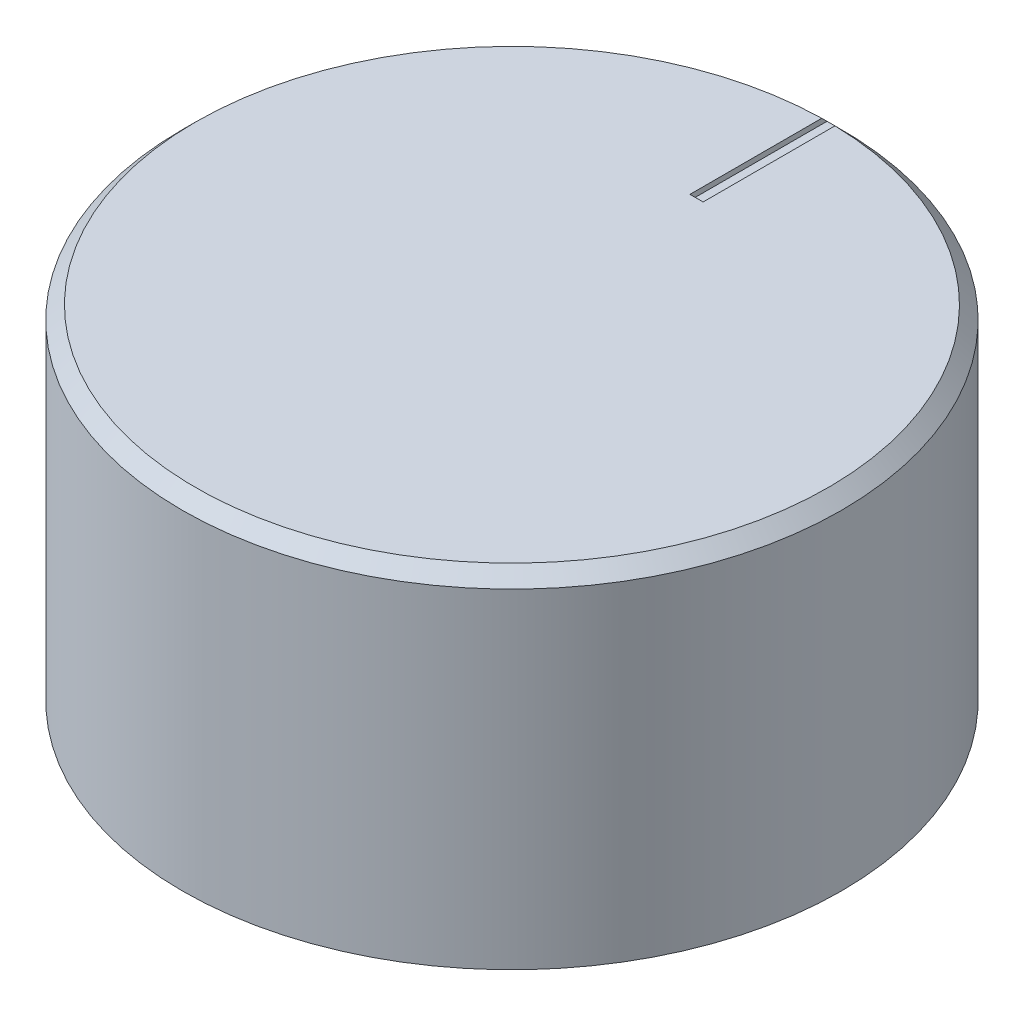
ISO-10303-21;
HEADER;
FILE_DESCRIPTION(('STEP AP214'),'2;1');
FILE_NAME('part.step','',(''),(''),'','','');
FILE_SCHEMA(('AUTOMOTIVE_DESIGN { 1 0 10303 214 1 1 1 1 }'));
ENDSEC;
DATA;
#1=APPLICATION_CONTEXT('core data for automotive mechanical design processes');
#2=APPLICATION_PROTOCOL_DEFINITION('international standard','automotive_design',2000,#1);
#3=PRODUCT_CONTEXT('',#1,'mechanical');
#4=PRODUCT('Part','Part','',(#3));
#5=PRODUCT_RELATED_PRODUCT_CATEGORY('part','',(#4));
#6=PRODUCT_DEFINITION_FORMATION('','',#4);
#7=PRODUCT_DEFINITION_CONTEXT('part definition',#1,'design');
#8=PRODUCT_DEFINITION('design','',#6,#7);
#9=PRODUCT_DEFINITION_SHAPE('','',#8);
#10=(LENGTH_UNIT() NAMED_UNIT(*) SI_UNIT(.MILLI.,.METRE.));
#11=(NAMED_UNIT(*) PLANE_ANGLE_UNIT() SI_UNIT($,.RADIAN.));
#12=(NAMED_UNIT(*) SI_UNIT($,.STERADIAN.) SOLID_ANGLE_UNIT());
#13=UNCERTAINTY_MEASURE_WITH_UNIT(LENGTH_MEASURE(1.E-05),#10,'distance_accuracy_value','');
#14=(GEOMETRIC_REPRESENTATION_CONTEXT(3) GLOBAL_UNCERTAINTY_ASSIGNED_CONTEXT((#13)) GLOBAL_UNIT_ASSIGNED_CONTEXT((#10,
#11,#12)) REPRESENTATION_CONTEXT('',''));
#15=CARTESIAN_POINT('',(0.,0.,0.));
#16=DIRECTION('',(0.,0.,1.));
#17=DIRECTION('',(1.,0.,0.));
#18=AXIS2_PLACEMENT_3D('',#15,#16,#17);
#19=CARTESIAN_POINT('',(0.,13.,0.));
#20=DIRECTION('',(0.,-1.,0.));
#21=DIRECTION('',(1.,0.,0.));
#22=AXIS2_PLACEMENT_3D('',#19,#20,#21);
#23=CONICAL_SURFACE('',#22,12.,0.785398163397448);
#24=CARTESIAN_POINT('',(0.,12.5,0.));
#25=DIRECTION('',(0.,-1.,0.));
#26=DIRECTION('',(1.,0.,0.));
#27=AXIS2_PLACEMENT_3D('',#24,#25,#26);
#28=CIRCLE('',#27,12.5);
#29=CARTESIAN_POINT('',(-0.26041666666667,12.5,-12.4972870319811));
#30=VERTEX_POINT('',#29);
#31=CARTESIAN_POINT('',(12.5,12.5,0.));
#32=VERTEX_POINT('',#31);
#33=EDGE_CURVE('E125',#30,#32,#28,.T.);
#34=ORIENTED_EDGE('',*,*,#33,.F.);
#35=CARTESIAN_POINT('',(0.,12.5,0.));
#36=DIRECTION('',(0.,-1.,0.));
#37=DIRECTION('',(1.,0.,0.));
#38=AXIS2_PLACEMENT_3D('',#35,#36,#37);
#39=CIRCLE('',#38,12.5);
#40=CARTESIAN_POINT('',(-12.5,12.5,0.));
#41=VERTEX_POINT('',#40);
#42=EDGE_CURVE('E28',#41,#30,#39,.T.);
#43=ORIENTED_EDGE('',*,*,#42,.F.);
#44=DIRECTION('',(0.707106781186547,0.707106781186548,0.));
#45=VECTOR('',#44,1.);
#46=CARTESIAN_POINT('',(-12.,13.,0.));
#47=LINE('',#46,#45);
#48=CARTESIAN_POINT('',(-12.,13.,0.));
#49=VERTEX_POINT('',#48);
#50=EDGE_CURVE('E11',#41,#49,#47,.T.);
#51=ORIENTED_EDGE('',*,*,#50,.T.);
#52=CARTESIAN_POINT('',(0.,13.,0.));
#53=DIRECTION('',(0.,1.,0.));
#54=DIRECTION('',(1.,0.,0.));
#55=AXIS2_PLACEMENT_3D('',#52,#53,#54);
#56=CIRCLE('',#55,12.);
#57=CARTESIAN_POINT('',(-0.250000000000004,13.,-11.9973955507018));
#58=VERTEX_POINT('',#57);
#59=EDGE_CURVE('E96',#58,#49,#56,.T.);
#60=ORIENTED_EDGE('',*,*,#59,.F.);
#61=DIRECTION('',(0.,0.707031292849307,0.707182261465768));
#62=VECTOR('',#61,1.);
#63=CARTESIAN_POINT('',(-0.25,12.8,-12.1974382556338));
#64=LINE('',#63,#62);
#65=CARTESIAN_POINT('',(-0.25,12.8,-12.1974382556338));
#66=VERTEX_POINT('',#65);
#67=EDGE_CURVE('E136',#66,#58,#64,.T.);
#68=ORIENTED_EDGE('',*,*,#67,.F.);
#69=CARTESIAN_POINT('',(0.,12.8,0.));
#70=DIRECTION('',(0.,1.,0.));
#71=DIRECTION('',(0.,0.,-1.));
#72=AXIS2_PLACEMENT_3D('',#69,#70,#71);
#73=CIRCLE('',#72,12.2);
#74=CARTESIAN_POINT('',(0.249999999999997,12.8,-12.1974382556338));
#75=VERTEX_POINT('',#74);
#76=EDGE_CURVE('E152',#75,#66,#73,.T.);
#77=ORIENTED_EDGE('',*,*,#76,.F.);
#78=DIRECTION('',(0.,-0.707031292849299,-0.707182261465776));
#79=VECTOR('',#78,1.);
#80=CARTESIAN_POINT('',(0.249999999999997,13.,-11.9973955507018));
#81=LINE('',#80,#79);
#82=CARTESIAN_POINT('',(0.249999999999997,13.,-11.9973955507018));
#83=VERTEX_POINT('',#82);
#84=EDGE_CURVE('E101',#83,#75,#81,.T.);
#85=ORIENTED_EDGE('',*,*,#84,.F.);
#86=CARTESIAN_POINT('',(0.,13.,0.));
#87=DIRECTION('',(0.,1.,0.));
#88=DIRECTION('',(1.,0.,0.));
#89=AXIS2_PLACEMENT_3D('',#86,#87,#88);
#90=CIRCLE('',#89,12.);
#91=EDGE_CURVE('E99',#49,#83,#90,.T.);
#92=ORIENTED_EDGE('',*,*,#91,.F.);
#93=ORIENTED_EDGE('',*,*,#50,.F.);
#94=CARTESIAN_POINT('',(0.,12.5,0.));
#95=DIRECTION('',(0.,-1.,0.));
#96=DIRECTION('',(1.,0.,0.));
#97=AXIS2_PLACEMENT_3D('',#94,#95,#96);
#98=CIRCLE('',#97,12.5);
#99=EDGE_CURVE('E49',#32,#41,#98,.T.);
#100=ORIENTED_EDGE('',*,*,#99,.F.);
#101=EDGE_LOOP('',(#34,#43,#51,#60,#68,#77,#85,#92,#93,#100));
#102=FACE_BOUND('',#101,.T.);
#103=ADVANCED_FACE('F18',(#102),#23,.T.);
#104=CARTESIAN_POINT('',(0.,13.,0.));
#105=DIRECTION('',(0.,1.,0.));
#106=DIRECTION('',(-1.,0.,0.));
#107=AXIS2_PLACEMENT_3D('',#104,#105,#106);
#108=CYLINDRICAL_SURFACE('',#107,12.5);
#109=ORIENTED_EDGE('',*,*,#33,.T.);
#110=DIRECTION('',(0.,-1.,0.));
#111=VECTOR('',#110,1.);
#112=CARTESIAN_POINT('',(12.5,13.,0.));
#113=LINE('',#112,#111);
#114=CARTESIAN_POINT('',(12.5,0.,0.));
#115=VERTEX_POINT('',#114);
#116=EDGE_CURVE('E22',#32,#115,#113,.T.);
#117=ORIENTED_EDGE('',*,*,#116,.T.);
#118=CARTESIAN_POINT('',(0.,0.,0.));
#119=DIRECTION('',(0.,1.,0.));
#120=DIRECTION('',(-1.,0.,0.));
#121=AXIS2_PLACEMENT_3D('',#118,#119,#120);
#122=CIRCLE('',#121,12.5);
#123=CARTESIAN_POINT('',(-12.5,0.,0.));
#124=VERTEX_POINT('',#123);
#125=EDGE_CURVE('E129',#115,#124,#122,.T.);
#126=ORIENTED_EDGE('',*,*,#125,.T.);
#127=CARTESIAN_POINT('',(0.,0.,0.));
#128=DIRECTION('',(0.,1.,0.));
#129=DIRECTION('',(-1.,0.,0.));
#130=AXIS2_PLACEMENT_3D('',#127,#128,#129);
#131=CIRCLE('',#130,12.5);
#132=EDGE_CURVE('E106',#124,#115,#131,.T.);
#133=ORIENTED_EDGE('',*,*,#132,.T.);
#134=ORIENTED_EDGE('',*,*,#116,.F.);
#135=ORIENTED_EDGE('',*,*,#99,.T.);
#136=ORIENTED_EDGE('',*,*,#42,.T.);
#137=EDGE_LOOP('',(#109,#117,#126,#133,#134,#135,#136));
#138=FACE_BOUND('',#137,.T.);
#139=ADVANCED_FACE('F202',(#138),#108,.T.);
#140=CARTESIAN_POINT('',(2.5,0.,0.));
#141=DIRECTION('',(0.,1.,0.));
#142=DIRECTION('',(1.,0.,0.));
#143=AXIS2_PLACEMENT_3D('',#140,#141,#142);
#144=PLANE('',#143);
#145=CARTESIAN_POINT('',(0.,0.,0.));
#146=DIRECTION('',(0.,-1.,0.));
#147=DIRECTION('',(-1.,0.,0.));
#148=AXIS2_PLACEMENT_3D('',#145,#146,#147);
#149=CIRCLE('',#148,2.5);
#150=CARTESIAN_POINT('',(-2.5,0.,0.));
#151=VERTEX_POINT('',#150);
#152=CARTESIAN_POINT('',(2.5,0.,0.));
#153=VERTEX_POINT('',#152);
#154=EDGE_CURVE('E159',#151,#153,#149,.T.);
#155=ORIENTED_EDGE('',*,*,#154,.F.);
#156=CARTESIAN_POINT('',(0.,0.,0.));
#157=DIRECTION('',(0.,-1.,0.));
#158=DIRECTION('',(-1.,0.,0.));
#159=AXIS2_PLACEMENT_3D('',#156,#157,#158);
#160=CIRCLE('',#159,2.5);
#161=EDGE_CURVE('E113',#153,#151,#160,.T.);
#162=ORIENTED_EDGE('',*,*,#161,.F.);
#163=EDGE_LOOP('',(#155,#162));
#164=FACE_BOUND('',#163,.T.);
#165=ORIENTED_EDGE('',*,*,#132,.F.);
#166=ORIENTED_EDGE('',*,*,#125,.F.);
#167=EDGE_LOOP('',(#165,#166));
#168=FACE_BOUND('',#167,.T.);
#169=ADVANCED_FACE('F20',(#164,#168),#144,.F.);
#170=CARTESIAN_POINT('',(12.5,13.,0.));
#171=DIRECTION('',(0.,-1.,0.));
#172=DIRECTION('',(0.,0.,-1.));
#173=AXIS2_PLACEMENT_3D('',#170,#171,#172);
#174=PLANE('',#173);
#175=DIRECTION('',(0.,0.,1.));
#176=VECTOR('',#175,1.);
#177=CARTESIAN_POINT('',(-0.250000000000004,13.,-11.9973955507018));
#178=LINE('',#177,#176);
#179=CARTESIAN_POINT('',(-0.25,13.,-7.));
#180=VERTEX_POINT('',#179);
#181=EDGE_CURVE('E110',#58,#180,#178,.T.);
#182=ORIENTED_EDGE('',*,*,#181,.F.);
#183=ORIENTED_EDGE('',*,*,#59,.T.);
#184=ORIENTED_EDGE('',*,*,#91,.T.);
#185=DIRECTION('',(0.,0.,-1.));
#186=VECTOR('',#185,1.);
#187=CARTESIAN_POINT('',(0.249999999999997,13.,-11.9973955507018));
#188=LINE('',#187,#186);
#189=CARTESIAN_POINT('',(0.249999999999997,13.,-7.));
#190=VERTEX_POINT('',#189);
#191=EDGE_CURVE('E123',#190,#83,#188,.T.);
#192=ORIENTED_EDGE('',*,*,#191,.F.);
#193=DIRECTION('',(1.,0.,0.));
#194=VECTOR('',#193,1.);
#195=CARTESIAN_POINT('',(-0.250000000000004,13.,-7.));
#196=LINE('',#195,#194);
#197=EDGE_CURVE('E147',#180,#190,#196,.T.);
#198=ORIENTED_EDGE('',*,*,#197,.F.);
#199=EDGE_LOOP('',(#182,#183,#184,#192,#198));
#200=FACE_BOUND('',#199,.T.);
#201=ADVANCED_FACE('F108',(#200),#174,.F.);
#202=CARTESIAN_POINT('',(0.,13.,0.));
#203=DIRECTION('',(0.,1.,0.));
#204=DIRECTION('',(-1.,0.,0.));
#205=AXIS2_PLACEMENT_3D('',#202,#203,#204);
#206=CYLINDRICAL_SURFACE('',#205,2.5);
#207=ORIENTED_EDGE('',*,*,#154,.T.);
#208=DIRECTION('',(0.,1.,0.));
#209=VECTOR('',#208,1.);
#210=CARTESIAN_POINT('',(2.5,13.,0.));
#211=LINE('',#210,#209);
#212=CARTESIAN_POINT('',(2.5,9.,0.));
#213=VERTEX_POINT('',#212);
#214=EDGE_CURVE('E119',#153,#213,#211,.T.);
#215=ORIENTED_EDGE('',*,*,#214,.T.);
#216=CARTESIAN_POINT('',(0.,9.,0.));
#217=DIRECTION('',(0.,-1.,0.));
#218=DIRECTION('',(-1.,0.,0.));
#219=AXIS2_PLACEMENT_3D('',#216,#217,#218);
#220=CIRCLE('',#219,2.5);
#221=CARTESIAN_POINT('',(-2.5,9.,0.));
#222=VERTEX_POINT('',#221);
#223=EDGE_CURVE('E134',#222,#213,#220,.T.);
#224=ORIENTED_EDGE('',*,*,#223,.F.);
#225=CARTESIAN_POINT('',(0.,9.,0.));
#226=DIRECTION('',(0.,-1.,0.));
#227=DIRECTION('',(-1.,0.,0.));
#228=AXIS2_PLACEMENT_3D('',#225,#226,#227);
#229=CIRCLE('',#228,2.5);
#230=EDGE_CURVE('E139',#213,#222,#229,.T.);
#231=ORIENTED_EDGE('',*,*,#230,.F.);
#232=ORIENTED_EDGE('',*,*,#214,.F.);
#233=ORIENTED_EDGE('',*,*,#161,.T.);
#234=EDGE_LOOP('',(#207,#215,#224,#231,#232,#233));
#235=FACE_BOUND('',#234,.T.);
#236=ADVANCED_FACE('F188',(#235),#206,.F.);
#237=CARTESIAN_POINT('',(0.249999999999997,12.8,-13.0578940556669));
#238=DIRECTION('',(-1.,0.,0.));
#239=DIRECTION('',(0.,1.,0.));
#240=AXIS2_PLACEMENT_3D('',#237,#238,#239);
#241=PLANE('',#240);
#242=ORIENTED_EDGE('',*,*,#191,.T.);
#243=ORIENTED_EDGE('',*,*,#84,.T.);
#244=DIRECTION('',(0.,0.,1.));
#245=VECTOR('',#244,1.);
#246=CARTESIAN_POINT('',(0.249999999999997,12.8,-12.1974382556338));
#247=LINE('',#246,#245);
#248=CARTESIAN_POINT('',(0.25,12.8,-7.));
#249=VERTEX_POINT('',#248);
#250=EDGE_CURVE('E225',#75,#249,#247,.T.);
#251=ORIENTED_EDGE('',*,*,#250,.T.);
#252=DIRECTION('',(0.,1.,0.));
#253=VECTOR('',#252,1.);
#254=CARTESIAN_POINT('',(0.25,12.8,-7.));
#255=LINE('',#254,#253);
#256=EDGE_CURVE('E143',#249,#190,#255,.T.);
#257=ORIENTED_EDGE('',*,*,#256,.T.);
#258=EDGE_LOOP('',(#242,#243,#251,#257));
#259=FACE_BOUND('',#258,.T.);
#260=ADVANCED_FACE('F190',(#259),#241,.T.);
#261=CARTESIAN_POINT('',(-0.25,12.8,-7.));
#262=DIRECTION('',(0.,0.,1.));
#263=DIRECTION('',(1.,0.,0.));
#264=AXIS2_PLACEMENT_3D('',#261,#262,#263);
#265=PLANE('',#264);
#266=ORIENTED_EDGE('',*,*,#256,.F.);
#267=DIRECTION('',(1.,0.,0.));
#268=VECTOR('',#267,1.);
#269=CARTESIAN_POINT('',(-0.25,12.8,-7.));
#270=LINE('',#269,#268);
#271=CARTESIAN_POINT('',(-0.25,12.8,-7.));
#272=VERTEX_POINT('',#271);
#273=EDGE_CURVE('E130',#272,#249,#270,.T.);
#274=ORIENTED_EDGE('',*,*,#273,.F.);
#275=DIRECTION('',(0.,-1.,0.));
#276=VECTOR('',#275,1.);
#277=CARTESIAN_POINT('',(-0.25,12.8,-7.));
#278=LINE('',#277,#276);
#279=EDGE_CURVE('E148',#180,#272,#278,.T.);
#280=ORIENTED_EDGE('',*,*,#279,.F.);
#281=ORIENTED_EDGE('',*,*,#197,.T.);
#282=EDGE_LOOP('',(#266,#274,#280,#281));
#283=FACE_BOUND('',#282,.T.);
#284=ADVANCED_FACE('F197',(#283),#265,.F.);
#285=CARTESIAN_POINT('',(-0.25,12.8,-13.0578940556669));
#286=DIRECTION('',(-1.,0.,0.));
#287=DIRECTION('',(0.,1.,0.));
#288=AXIS2_PLACEMENT_3D('',#285,#286,#287);
#289=PLANE('',#288);
#290=DIRECTION('',(0.,0.,1.));
#291=VECTOR('',#290,1.);
#292=CARTESIAN_POINT('',(-0.25,12.8,-12.1974382556338));
#293=LINE('',#292,#291);
#294=EDGE_CURVE('E135',#66,#272,#293,.T.);
#295=ORIENTED_EDGE('',*,*,#294,.F.);
#296=ORIENTED_EDGE('',*,*,#67,.T.);
#297=ORIENTED_EDGE('',*,*,#181,.T.);
#298=ORIENTED_EDGE('',*,*,#279,.T.);
#299=EDGE_LOOP('',(#295,#296,#297,#298));
#300=FACE_BOUND('',#299,.T.);
#301=ADVANCED_FACE('F212',(#300),#289,.F.);
#302=CARTESIAN_POINT('',(0.,9.,0.));
#303=DIRECTION('',(0.,1.,0.));
#304=DIRECTION('',(1.,0.,0.));
#305=AXIS2_PLACEMENT_3D('',#302,#303,#304);
#306=PLANE('',#305);
#307=ORIENTED_EDGE('',*,*,#223,.T.);
#308=ORIENTED_EDGE('',*,*,#230,.T.);
#309=EDGE_LOOP('',(#307,#308));
#310=FACE_BOUND('',#309,.T.);
#311=ADVANCED_FACE('F184',(#310),#306,.F.);
#312=CARTESIAN_POINT('',(0.,12.8,0.));
#313=DIRECTION('',(0.,-1.,0.));
#314=DIRECTION('',(0.,0.,-1.));
#315=AXIS2_PLACEMENT_3D('',#312,#313,#314);
#316=PLANE('',#315);
#317=ORIENTED_EDGE('',*,*,#250,.F.);
#318=ORIENTED_EDGE('',*,*,#76,.T.);
#319=ORIENTED_EDGE('',*,*,#294,.T.);
#320=ORIENTED_EDGE('',*,*,#273,.T.);
#321=EDGE_LOOP('',(#317,#318,#319,#320));
#322=FACE_BOUND('',#321,.T.);
#323=ADVANCED_FACE('F211',(#322),#316,.F.);
#324=CLOSED_SHELL('',(#103,#139,#169,#201,#236,#260,#284,#301,#311,#323));
#325=MANIFOLD_SOLID_BREP('B1',#324);
#326=ADVANCED_BREP_SHAPE_REPRESENTATION('',(#18,#325),#14);
#327=SHAPE_DEFINITION_REPRESENTATION(#9,#326);
ENDSEC;
END-ISO-10303-21;
